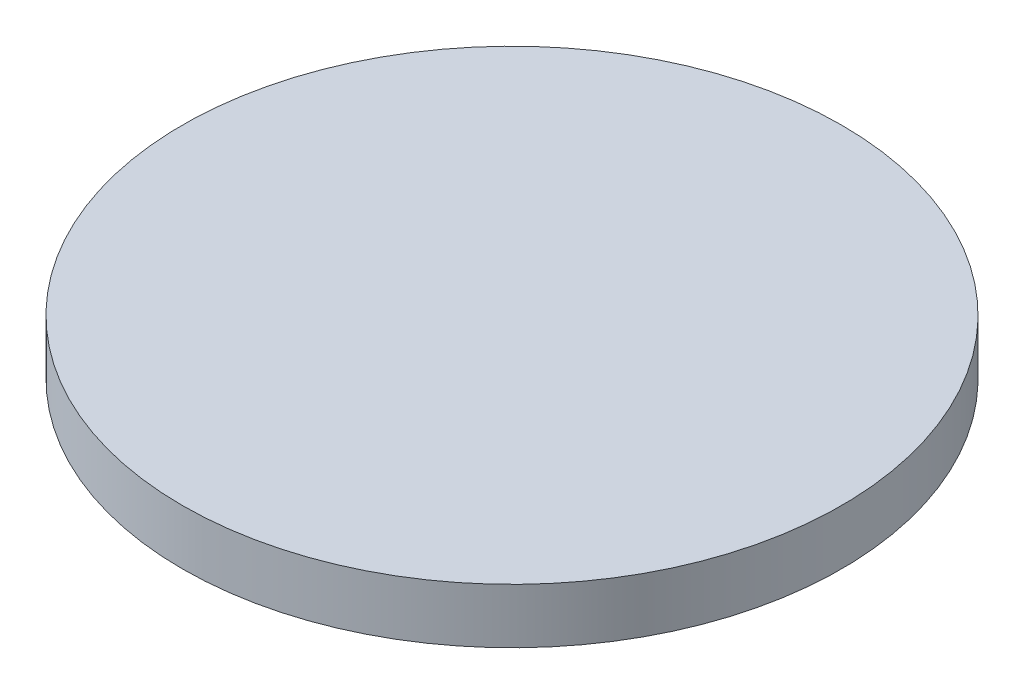
ISO-10303-21;
HEADER;
FILE_DESCRIPTION(('STEP AP214'),'2;1');
FILE_NAME('part.step','',(''),(''),'','','');
FILE_SCHEMA(('AUTOMOTIVE_DESIGN { 1 0 10303 214 1 1 1 1 }'));
ENDSEC;
DATA;
#1=APPLICATION_CONTEXT('core data for automotive mechanical design processes');
#2=APPLICATION_PROTOCOL_DEFINITION('international standard','automotive_design',2000,#1);
#3=PRODUCT_CONTEXT('',#1,'mechanical');
#4=PRODUCT('Part','Part','',(#3));
#5=PRODUCT_RELATED_PRODUCT_CATEGORY('part','',(#4));
#6=PRODUCT_DEFINITION_FORMATION('','',#4);
#7=PRODUCT_DEFINITION_CONTEXT('part definition',#1,'design');
#8=PRODUCT_DEFINITION('design','',#6,#7);
#9=PRODUCT_DEFINITION_SHAPE('','',#8);
#10=(LENGTH_UNIT() NAMED_UNIT(*) SI_UNIT(.MILLI.,.METRE.));
#11=(NAMED_UNIT(*) PLANE_ANGLE_UNIT() SI_UNIT($,.RADIAN.));
#12=(NAMED_UNIT(*) SI_UNIT($,.STERADIAN.) SOLID_ANGLE_UNIT());
#13=UNCERTAINTY_MEASURE_WITH_UNIT(LENGTH_MEASURE(1.E-05),#10,'distance_accuracy_value','');
#14=(GEOMETRIC_REPRESENTATION_CONTEXT(3) GLOBAL_UNCERTAINTY_ASSIGNED_CONTEXT((#13)) GLOBAL_UNIT_ASSIGNED_CONTEXT((#10,
#11,#12)) REPRESENTATION_CONTEXT('',''));
#15=CARTESIAN_POINT('',(0.,0.,0.));
#16=DIRECTION('',(0.,0.,1.));
#17=DIRECTION('',(1.,0.,0.));
#18=AXIS2_PLACEMENT_3D('',#15,#16,#17);
#19=CARTESIAN_POINT('',(0.,5.,0.));
#20=DIRECTION('',(0.,-1.,0.));
#21=DIRECTION('',(0.,0.,-1.));
#22=AXIS2_PLACEMENT_3D('',#19,#20,#21);
#23=CYLINDRICAL_SURFACE('',#22,30.);
#24=CARTESIAN_POINT('',(0.,5.,0.));
#25=DIRECTION('',(0.,1.,0.));
#26=DIRECTION('',(0.,0.,1.));
#27=AXIS2_PLACEMENT_3D('',#24,#25,#26);
#28=CIRCLE('',#27,30.);
#29=CARTESIAN_POINT('',(0.,5.,30.));
#30=VERTEX_POINT('',#29);
#31=EDGE_CURVE('E11',#30,#30,#28,.T.);
#32=ORIENTED_EDGE('',*,*,#31,.F.);
#33=EDGE_LOOP('',(#32));
#34=FACE_BOUND('',#33,.T.);
#35=CARTESIAN_POINT('',(0.,0.,0.));
#36=DIRECTION('',(0.,1.,0.));
#37=DIRECTION('',(0.,0.,1.));
#38=AXIS2_PLACEMENT_3D('',#35,#36,#37);
#39=CIRCLE('',#38,30.);
#40=CARTESIAN_POINT('',(0.,0.,30.));
#41=VERTEX_POINT('',#40);
#42=EDGE_CURVE('E45',#41,#41,#39,.T.);
#43=ORIENTED_EDGE('',*,*,#42,.T.);
#44=EDGE_LOOP('',(#43));
#45=FACE_BOUND('',#44,.T.);
#46=ADVANCED_FACE('F42',(#34,#45),#23,.T.);
#47=CARTESIAN_POINT('',(0.,5.,0.));
#48=DIRECTION('',(0.,1.,0.));
#49=DIRECTION('',(0.,0.,1.));
#50=AXIS2_PLACEMENT_3D('',#47,#48,#49);
#51=PLANE('',#50);
#52=ORIENTED_EDGE('',*,*,#31,.T.);
#53=EDGE_LOOP('',(#52));
#54=FACE_BOUND('',#53,.T.);
#55=ADVANCED_FACE('F231',(#54),#51,.T.);
#56=CARTESIAN_POINT('',(0.,0.,0.));
#57=DIRECTION('',(0.,1.,0.));
#58=DIRECTION('',(0.,0.,1.));
#59=AXIS2_PLACEMENT_3D('',#56,#57,#58);
#60=PLANE('',#59);
#61=DIRECTION('',(0.465109537309555,0.,-0.885253137980144));
#62=VECTOR('',#61,1.);
#63=CARTESIAN_POINT('',(-3.04035958399108,0.,-5.28830914376548));
#64=LINE('',#63,#62);
#65=CARTESIAN_POINT('',(-3.04035958399108,0.,-5.28830914376548));
#66=VERTEX_POINT('',#65);
#67=CARTESIAN_POINT('',(3.06521580111309,0.,-16.9091840888442));
#68=VERTEX_POINT('',#67);
#69=EDGE_CURVE('E149',#66,#68,#64,.T.);
#70=ORIENTED_EDGE('',*,*,#69,.F.);
#71=CARTESIAN_POINT('',(0.,0.,0.));
#72=DIRECTION('',(0.,-1.,0.));
#73=DIRECTION('',(0.,0.,-1.));
#74=AXIS2_PLACEMENT_3D('',#71,#72,#73);
#75=CIRCLE('',#74,6.1);
#76=CARTESIAN_POINT('',(-5.64932971103259,0.,2.30110273913278));
#77=VERTEX_POINT('',#76);
#78=EDGE_CURVE('E57',#77,#66,#75,.T.);
#79=ORIENTED_EDGE('',*,*,#78,.F.);
#80=DIRECTION('',(0.177513933416816,0.,-0.984118287322662));
#81=VECTOR('',#80,1.);
#82=CARTESIAN_POINT('',(-7.97958659772677,0.,15.219798033719));
#83=LINE('',#82,#81);
#84=CARTESIAN_POINT('',(-7.97958659772677,0.,15.219798033719));
#85=VERTEX_POINT('',#84);
#86=EDGE_CURVE('E170',#85,#77,#83,.T.);
#87=ORIENTED_EDGE('',*,*,#86,.F.);
#88=CARTESIAN_POINT('',(-5.33350068476914,0.,15.5149854169981));
#89=DIRECTION('',(0.,-1.,0.));
#90=DIRECTION('',(0.,0.,-1.));
#91=AXIS2_PLACEMENT_3D('',#88,#89,#90);
#92=CIRCLE('',#91,2.6625);
#93=CARTESIAN_POINT('',(-3.06521580111308,0.,16.9091840888442));
#94=VERTEX_POINT('',#93);
#95=EDGE_CURVE('E167',#94,#85,#92,.T.);
#96=ORIENTED_EDGE('',*,*,#95,.F.);
#97=DIRECTION('',(-0.465109537309555,0.,0.885253137980144));
#98=VECTOR('',#97,1.);
#99=CARTESIAN_POINT('',(3.04035958399108,0.,5.28830914376548));
#100=LINE('',#99,#98);
#101=CARTESIAN_POINT('',(3.04035958399108,0.,5.28830914376548));
#102=VERTEX_POINT('',#101);
#103=EDGE_CURVE('E117',#102,#94,#100,.T.);
#104=ORIENTED_EDGE('',*,*,#103,.F.);
#105=CARTESIAN_POINT('',(0.,0.,0.));
#106=DIRECTION('',(0.,-1.,0.));
#107=DIRECTION('',(0.,0.,-1.));
#108=AXIS2_PLACEMENT_3D('',#105,#106,#107);
#109=CIRCLE('',#108,6.1);
#110=CARTESIAN_POINT('',(5.64932971103259,0.,-2.30110273913278));
#111=VERTEX_POINT('',#110);
#112=EDGE_CURVE('E161',#111,#102,#109,.T.);
#113=ORIENTED_EDGE('',*,*,#112,.F.);
#114=DIRECTION('',(-0.177513933416816,0.,0.984118287322662));
#115=VECTOR('',#114,1.);
#116=CARTESIAN_POINT('',(7.97958659772676,0.,-15.219798033719));
#117=LINE('',#116,#115);
#118=CARTESIAN_POINT('',(7.97958659772676,0.,-15.219798033719));
#119=VERTEX_POINT('',#118);
#120=EDGE_CURVE('E157',#119,#111,#117,.T.);
#121=ORIENTED_EDGE('',*,*,#120,.F.);
#122=CARTESIAN_POINT('',(5.33350068476914,0.,-15.5149854169981));
#123=DIRECTION('',(0.,-1.,0.));
#124=DIRECTION('',(0.,0.,-1.));
#125=AXIS2_PLACEMENT_3D('',#122,#123,#124);
#126=CIRCLE('',#125,2.6625);
#127=EDGE_CURVE('E153',#68,#119,#126,.T.);
#128=ORIENTED_EDGE('',*,*,#127,.F.);
#129=EDGE_LOOP('',(#70,#79,#87,#96,#104,#113,#121,#128));
#130=FACE_BOUND('',#129,.T.);
#131=ORIENTED_EDGE('',*,*,#42,.F.);
#132=EDGE_LOOP('',(#131));
#133=FACE_BOUND('',#132,.T.);
#134=ADVANCED_FACE('F197',(#130,#133),#60,.F.);
#135=CARTESIAN_POINT('',(0.,2.5,0.));
#136=DIRECTION('',(0.,-1.,0.));
#137=DIRECTION('',(0.,0.,-1.));
#138=AXIS2_PLACEMENT_3D('',#135,#136,#137);
#139=CYLINDRICAL_SURFACE('',#138,6.1);
#140=ORIENTED_EDGE('',*,*,#78,.T.);
#141=DIRECTION('',(0.,-1.,0.));
#142=VECTOR('',#141,1.);
#143=CARTESIAN_POINT('',(-3.04035958399108,2.5,-5.28830914376548));
#144=LINE('',#143,#142);
#145=CARTESIAN_POINT('',(-3.04035958399108,2.5,-5.28830914376548));
#146=VERTEX_POINT('',#145);
#147=EDGE_CURVE('E93',#146,#66,#144,.T.);
#148=ORIENTED_EDGE('',*,*,#147,.F.);
#149=CARTESIAN_POINT('',(0.,2.5,0.));
#150=DIRECTION('',(0.,-1.,0.));
#151=DIRECTION('',(0.,0.,-1.));
#152=AXIS2_PLACEMENT_3D('',#149,#150,#151);
#153=CIRCLE('',#152,6.1);
#154=CARTESIAN_POINT('',(-5.64932971103259,2.5,2.30110273913278));
#155=VERTEX_POINT('',#154);
#156=EDGE_CURVE('E173',#155,#146,#153,.T.);
#157=ORIENTED_EDGE('',*,*,#156,.F.);
#158=DIRECTION('',(0.,-1.,0.));
#159=VECTOR('',#158,1.);
#160=CARTESIAN_POINT('',(-5.64932971103259,2.5,2.30110273913278));
#161=LINE('',#160,#159);
#162=EDGE_CURVE('E65',#155,#77,#161,.T.);
#163=ORIENTED_EDGE('',*,*,#162,.T.);
#164=EDGE_LOOP('',(#140,#148,#157,#163));
#165=FACE_BOUND('',#164,.T.);
#166=ADVANCED_FACE('F221',(#165),#139,.F.);
#167=CARTESIAN_POINT('',(-7.97958659772677,2.5,15.219798033719));
#168=DIRECTION('',(-0.984118287322662,0.,-0.177513933416816));
#169=DIRECTION('',(-0.177513933416816,0.,0.984118287322662));
#170=AXIS2_PLACEMENT_3D('',#167,#168,#169);
#171=PLANE('',#170);
#172=ORIENTED_EDGE('',*,*,#86,.T.);
#173=ORIENTED_EDGE('',*,*,#162,.F.);
#174=DIRECTION('',(0.177513933416816,0.,-0.984118287322662));
#175=VECTOR('',#174,1.);
#176=CARTESIAN_POINT('',(-7.97958659772677,2.5,15.219798033719));
#177=LINE('',#176,#175);
#178=CARTESIAN_POINT('',(-7.97958659772677,2.5,15.219798033719));
#179=VERTEX_POINT('',#178);
#180=EDGE_CURVE('E131',#179,#155,#177,.T.);
#181=ORIENTED_EDGE('',*,*,#180,.F.);
#182=DIRECTION('',(0.,-1.,0.));
#183=VECTOR('',#182,1.);
#184=CARTESIAN_POINT('',(-7.97958659772677,2.5,15.219798033719));
#185=LINE('',#184,#183);
#186=EDGE_CURVE('E122',#179,#85,#185,.T.);
#187=ORIENTED_EDGE('',*,*,#186,.T.);
#188=EDGE_LOOP('',(#172,#173,#181,#187));
#189=FACE_BOUND('',#188,.T.);
#190=ADVANCED_FACE('F219',(#189),#171,.F.);
#191=CARTESIAN_POINT('',(-5.33350068476914,2.5,15.5149854169981));
#192=DIRECTION('',(0.,-1.,0.));
#193=DIRECTION('',(0.,0.,-1.));
#194=AXIS2_PLACEMENT_3D('',#191,#192,#193);
#195=CYLINDRICAL_SURFACE('',#194,2.6625);
#196=ORIENTED_EDGE('',*,*,#95,.T.);
#197=ORIENTED_EDGE('',*,*,#186,.F.);
#198=CARTESIAN_POINT('',(-5.33350068476914,2.5,15.5149854169981));
#199=DIRECTION('',(0.,-1.,0.));
#200=DIRECTION('',(0.,0.,-1.));
#201=AXIS2_PLACEMENT_3D('',#198,#199,#200);
#202=CIRCLE('',#201,2.6625);
#203=CARTESIAN_POINT('',(-3.06521580111308,2.5,16.9091840888442));
#204=VERTEX_POINT('',#203);
#205=EDGE_CURVE('E126',#204,#179,#202,.T.);
#206=ORIENTED_EDGE('',*,*,#205,.F.);
#207=DIRECTION('',(0.,-1.,0.));
#208=VECTOR('',#207,1.);
#209=CARTESIAN_POINT('',(-3.06521580111308,2.5,16.9091840888442));
#210=LINE('',#209,#208);
#211=EDGE_CURVE('E110',#204,#94,#210,.T.);
#212=ORIENTED_EDGE('',*,*,#211,.T.);
#213=EDGE_LOOP('',(#196,#197,#206,#212));
#214=FACE_BOUND('',#213,.T.);
#215=ADVANCED_FACE('F127',(#214),#195,.F.);
#216=CARTESIAN_POINT('',(3.04035958399108,2.5,5.28830914376548));
#217=DIRECTION('',(0.885253137980144,0.,0.465109537309555));
#218=DIRECTION('',(0.465109537309555,0.,-0.885253137980144));
#219=AXIS2_PLACEMENT_3D('',#216,#217,#218);
#220=PLANE('',#219);
#221=ORIENTED_EDGE('',*,*,#103,.T.);
#222=ORIENTED_EDGE('',*,*,#211,.F.);
#223=DIRECTION('',(-0.465109537309555,0.,0.885253137980144));
#224=VECTOR('',#223,1.);
#225=CARTESIAN_POINT('',(3.04035958399108,2.5,5.28830914376548));
#226=LINE('',#225,#224);
#227=CARTESIAN_POINT('',(3.04035958399108,2.5,5.28830914376548));
#228=VERTEX_POINT('',#227);
#229=EDGE_CURVE('E114',#228,#204,#226,.T.);
#230=ORIENTED_EDGE('',*,*,#229,.F.);
#231=DIRECTION('',(0.,-1.,0.));
#232=VECTOR('',#231,1.);
#233=CARTESIAN_POINT('',(3.04035958399108,2.5,5.28830914376548));
#234=LINE('',#233,#232);
#235=EDGE_CURVE('E123',#228,#102,#234,.T.);
#236=ORIENTED_EDGE('',*,*,#235,.T.);
#237=EDGE_LOOP('',(#221,#222,#230,#236));
#238=FACE_BOUND('',#237,.T.);
#239=ADVANCED_FACE('F112',(#238),#220,.F.);
#240=CARTESIAN_POINT('',(0.,2.5,0.));
#241=DIRECTION('',(0.,-1.,0.));
#242=DIRECTION('',(0.,0.,-1.));
#243=AXIS2_PLACEMENT_3D('',#240,#241,#242);
#244=CYLINDRICAL_SURFACE('',#243,6.1);
#245=ORIENTED_EDGE('',*,*,#112,.T.);
#246=ORIENTED_EDGE('',*,*,#235,.F.);
#247=CARTESIAN_POINT('',(0.,2.5,0.));
#248=DIRECTION('',(0.,-1.,0.));
#249=DIRECTION('',(0.,0.,-1.));
#250=AXIS2_PLACEMENT_3D('',#247,#248,#249);
#251=CIRCLE('',#250,6.1);
#252=CARTESIAN_POINT('',(5.64932971103259,2.5,-2.30110273913278));
#253=VERTEX_POINT('',#252);
#254=EDGE_CURVE('E137',#253,#228,#251,.T.);
#255=ORIENTED_EDGE('',*,*,#254,.F.);
#256=DIRECTION('',(0.,-1.,0.));
#257=VECTOR('',#256,1.);
#258=CARTESIAN_POINT('',(5.64932971103259,2.5,-2.30110273913278));
#259=LINE('',#258,#257);
#260=EDGE_CURVE('E180',#253,#111,#259,.T.);
#261=ORIENTED_EDGE('',*,*,#260,.T.);
#262=EDGE_LOOP('',(#245,#246,#255,#261));
#263=FACE_BOUND('',#262,.T.);
#264=ADVANCED_FACE('F218',(#263),#244,.F.);
#265=CARTESIAN_POINT('',(7.97958659772676,2.5,-15.219798033719));
#266=DIRECTION('',(0.984118287322662,0.,0.177513933416816));
#267=DIRECTION('',(0.177513933416816,0.,-0.984118287322662));
#268=AXIS2_PLACEMENT_3D('',#265,#266,#267);
#269=PLANE('',#268);
#270=ORIENTED_EDGE('',*,*,#120,.T.);
#271=ORIENTED_EDGE('',*,*,#260,.F.);
#272=DIRECTION('',(-0.177513933416816,0.,0.984118287322662));
#273=VECTOR('',#272,1.);
#274=CARTESIAN_POINT('',(7.97958659772676,2.5,-15.219798033719));
#275=LINE('',#274,#273);
#276=CARTESIAN_POINT('',(7.97958659772676,2.5,-15.219798033719));
#277=VERTEX_POINT('',#276);
#278=EDGE_CURVE('E141',#277,#253,#275,.T.);
#279=ORIENTED_EDGE('',*,*,#278,.F.);
#280=DIRECTION('',(0.,-1.,0.));
#281=VECTOR('',#280,1.);
#282=CARTESIAN_POINT('',(7.97958659772676,2.5,-15.219798033719));
#283=LINE('',#282,#281);
#284=EDGE_CURVE('E183',#277,#119,#283,.T.);
#285=ORIENTED_EDGE('',*,*,#284,.T.);
#286=EDGE_LOOP('',(#270,#271,#279,#285));
#287=FACE_BOUND('',#286,.T.);
#288=ADVANCED_FACE('F216',(#287),#269,.F.);
#289=CARTESIAN_POINT('',(5.33350068476914,2.5,-15.5149854169981));
#290=DIRECTION('',(0.,-1.,0.));
#291=DIRECTION('',(0.,0.,-1.));
#292=AXIS2_PLACEMENT_3D('',#289,#290,#291);
#293=CYLINDRICAL_SURFACE('',#292,2.6625);
#294=ORIENTED_EDGE('',*,*,#127,.T.);
#295=ORIENTED_EDGE('',*,*,#284,.F.);
#296=CARTESIAN_POINT('',(5.33350068476914,2.5,-15.5149854169981));
#297=DIRECTION('',(0.,-1.,0.));
#298=DIRECTION('',(0.,0.,-1.));
#299=AXIS2_PLACEMENT_3D('',#296,#297,#298);
#300=CIRCLE('',#299,2.6625);
#301=CARTESIAN_POINT('',(3.06521580111309,2.5,-16.9091840888442));
#302=VERTEX_POINT('',#301);
#303=EDGE_CURVE('E207',#302,#277,#300,.T.);
#304=ORIENTED_EDGE('',*,*,#303,.F.);
#305=DIRECTION('',(0.,-1.,0.));
#306=VECTOR('',#305,1.);
#307=CARTESIAN_POINT('',(3.06521580111309,2.5,-16.9091840888442));
#308=LINE('',#307,#306);
#309=EDGE_CURVE('E186',#302,#68,#308,.T.);
#310=ORIENTED_EDGE('',*,*,#309,.T.);
#311=EDGE_LOOP('',(#294,#295,#304,#310));
#312=FACE_BOUND('',#311,.T.);
#313=ADVANCED_FACE('F203',(#312),#293,.F.);
#314=CARTESIAN_POINT('',(-3.04035958399108,2.5,-5.28830914376548));
#315=DIRECTION('',(-0.885253137980144,0.,-0.465109537309555));
#316=DIRECTION('',(-0.465109537309555,0.,0.885253137980144));
#317=AXIS2_PLACEMENT_3D('',#314,#315,#316);
#318=PLANE('',#317);
#319=ORIENTED_EDGE('',*,*,#69,.T.);
#320=ORIENTED_EDGE('',*,*,#309,.F.);
#321=DIRECTION('',(0.465109537309555,0.,-0.885253137980144));
#322=VECTOR('',#321,1.);
#323=CARTESIAN_POINT('',(-3.04035958399108,2.5,-5.28830914376548));
#324=LINE('',#323,#322);
#325=EDGE_CURVE('E195',#146,#302,#324,.T.);
#326=ORIENTED_EDGE('',*,*,#325,.F.);
#327=ORIENTED_EDGE('',*,*,#147,.T.);
#328=EDGE_LOOP('',(#319,#320,#326,#327));
#329=FACE_BOUND('',#328,.T.);
#330=ADVANCED_FACE('F192',(#329),#318,.F.);
#331=CARTESIAN_POINT('',(0.,2.5,0.));
#332=DIRECTION('',(0.,-1.,0.));
#333=DIRECTION('',(0.,0.,-1.));
#334=AXIS2_PLACEMENT_3D('',#331,#332,#333);
#335=PLANE('',#334);
#336=ORIENTED_EDGE('',*,*,#156,.T.);
#337=ORIENTED_EDGE('',*,*,#325,.T.);
#338=ORIENTED_EDGE('',*,*,#303,.T.);
#339=ORIENTED_EDGE('',*,*,#278,.T.);
#340=ORIENTED_EDGE('',*,*,#254,.T.);
#341=ORIENTED_EDGE('',*,*,#229,.T.);
#342=ORIENTED_EDGE('',*,*,#205,.T.);
#343=ORIENTED_EDGE('',*,*,#180,.T.);
#344=EDGE_LOOP('',(#336,#337,#338,#339,#340,#341,#342,#343));
#345=FACE_BOUND('',#344,.T.);
#346=ADVANCED_FACE('F134',(#345),#335,.T.);
#347=CLOSED_SHELL('',(#46,#55,#134,#166,#190,#215,#239,#264,#288,#313,#330,#346));
#348=MANIFOLD_SOLID_BREP('B2',#347);
#349=ADVANCED_BREP_SHAPE_REPRESENTATION('',(#18,#348),#14);
#350=SHAPE_DEFINITION_REPRESENTATION(#9,#349);
ENDSEC;
END-ISO-10303-21;
